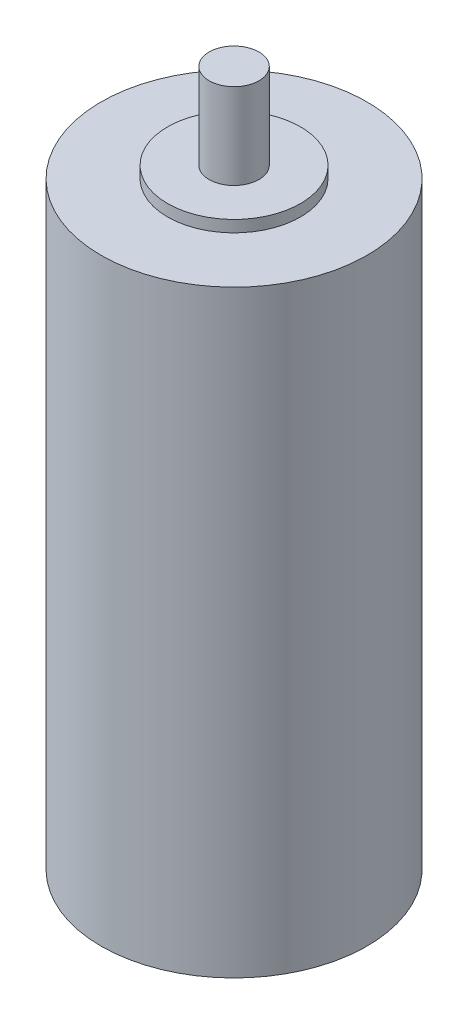
ISO-10303-21;
HEADER;
FILE_DESCRIPTION(('STEP AP214'),'2;1');
FILE_NAME('part.step','',(''),(''),'','','');
FILE_SCHEMA(('AUTOMOTIVE_DESIGN { 1 0 10303 214 1 1 1 1 }'));
ENDSEC;
DATA;
#1=APPLICATION_CONTEXT('core data for automotive mechanical design processes');
#2=APPLICATION_PROTOCOL_DEFINITION('international standard','automotive_design',2000,#1);
#3=PRODUCT_CONTEXT('',#1,'mechanical');
#4=PRODUCT('Part','Part','',(#3));
#5=PRODUCT_RELATED_PRODUCT_CATEGORY('part','',(#4));
#6=PRODUCT_DEFINITION_FORMATION('','',#4);
#7=PRODUCT_DEFINITION_CONTEXT('part definition',#1,'design');
#8=PRODUCT_DEFINITION('design','',#6,#7);
#9=PRODUCT_DEFINITION_SHAPE('','',#8);
#10=(LENGTH_UNIT() NAMED_UNIT(*) SI_UNIT(.MILLI.,.METRE.));
#11=(NAMED_UNIT(*) PLANE_ANGLE_UNIT() SI_UNIT($,.RADIAN.));
#12=(NAMED_UNIT(*) SI_UNIT($,.STERADIAN.) SOLID_ANGLE_UNIT());
#13=UNCERTAINTY_MEASURE_WITH_UNIT(LENGTH_MEASURE(1.E-05),#10,'distance_accuracy_value','');
#14=(GEOMETRIC_REPRESENTATION_CONTEXT(3) GLOBAL_UNCERTAINTY_ASSIGNED_CONTEXT((#13)) GLOBAL_UNIT_ASSIGNED_CONTEXT((#10,
#11,#12)) REPRESENTATION_CONTEXT('',''));
#15=CARTESIAN_POINT('',(0.,0.,0.));
#16=DIRECTION('',(0.,0.,1.));
#17=DIRECTION('',(1.,0.,0.));
#18=AXIS2_PLACEMENT_3D('',#15,#16,#17);
#19=CARTESIAN_POINT('',(0.,72.,0.));
#20=DIRECTION('',(0.,-1.,0.));
#21=DIRECTION('',(0.,0.,-1.));
#22=AXIS2_PLACEMENT_3D('',#19,#20,#21);
#23=CYLINDRICAL_SURFACE('',#22,16.);
#24=CARTESIAN_POINT('',(0.,72.,0.));
#25=DIRECTION('',(0.,1.,0.));
#26=DIRECTION('',(0.,0.,1.));
#27=AXIS2_PLACEMENT_3D('',#24,#25,#26);
#28=CIRCLE('',#27,16.);
#29=CARTESIAN_POINT('',(0.,72.,16.));
#30=VERTEX_POINT('',#29);
#31=EDGE_CURVE('E44',#30,#30,#28,.T.);
#32=ORIENTED_EDGE('',*,*,#31,.F.);
#33=EDGE_LOOP('',(#32));
#34=FACE_BOUND('',#33,.T.);
#35=CARTESIAN_POINT('',(0.,0.,0.));
#36=DIRECTION('',(0.,1.,0.));
#37=DIRECTION('',(0.,0.,1.));
#38=AXIS2_PLACEMENT_3D('',#35,#36,#37);
#39=CIRCLE('',#38,16.);
#40=CARTESIAN_POINT('',(0.,0.,16.));
#41=VERTEX_POINT('',#40);
#42=EDGE_CURVE('E50',#41,#41,#39,.T.);
#43=ORIENTED_EDGE('',*,*,#42,.T.);
#44=EDGE_LOOP('',(#43));
#45=FACE_BOUND('',#44,.T.);
#46=ADVANCED_FACE('F36',(#34,#45),#23,.T.);
#47=CARTESIAN_POINT('',(0.,72.,0.));
#48=DIRECTION('',(0.,1.,0.));
#49=DIRECTION('',(0.,0.,1.));
#50=AXIS2_PLACEMENT_3D('',#47,#48,#49);
#51=PLANE('',#50);
#52=CARTESIAN_POINT('',(0.,72.,0.));
#53=DIRECTION('',(0.,1.,0.));
#54=DIRECTION('',(0.,0.,1.));
#55=AXIS2_PLACEMENT_3D('',#52,#53,#54);
#56=CIRCLE('',#55,8.);
#57=CARTESIAN_POINT('',(0.,72.,8.));
#58=VERTEX_POINT('',#57);
#59=EDGE_CURVE('E10',#58,#58,#56,.T.);
#60=ORIENTED_EDGE('',*,*,#59,.F.);
#61=EDGE_LOOP('',(#60));
#62=FACE_BOUND('',#61,.T.);
#63=ORIENTED_EDGE('',*,*,#31,.T.);
#64=EDGE_LOOP('',(#63));
#65=FACE_BOUND('',#64,.T.);
#66=ADVANCED_FACE('F87',(#62,#65),#51,.T.);
#67=CARTESIAN_POINT('',(0.,0.,0.));
#68=DIRECTION('',(0.,1.,0.));
#69=DIRECTION('',(0.,0.,1.));
#70=AXIS2_PLACEMENT_3D('',#67,#68,#69);
#71=PLANE('',#70);
#72=ORIENTED_EDGE('',*,*,#42,.F.);
#73=EDGE_LOOP('',(#72));
#74=FACE_BOUND('',#73,.T.);
#75=ADVANCED_FACE('F92',(#74),#71,.F.);
#76=CARTESIAN_POINT('',(0.,73.4,0.));
#77=DIRECTION('',(0.,-1.,0.));
#78=DIRECTION('',(0.,0.,-1.));
#79=AXIS2_PLACEMENT_3D('',#76,#77,#78);
#80=CYLINDRICAL_SURFACE('',#79,8.);
#81=CARTESIAN_POINT('',(0.,73.4,0.));
#82=DIRECTION('',(0.,1.,0.));
#83=DIRECTION('',(0.,0.,1.));
#84=AXIS2_PLACEMENT_3D('',#81,#82,#83);
#85=CIRCLE('',#84,8.);
#86=CARTESIAN_POINT('',(0.,73.4,8.));
#87=VERTEX_POINT('',#86);
#88=EDGE_CURVE('E53',#87,#87,#85,.T.);
#89=ORIENTED_EDGE('',*,*,#88,.F.);
#90=EDGE_LOOP('',(#89));
#91=FACE_BOUND('',#90,.T.);
#92=ORIENTED_EDGE('',*,*,#59,.T.);
#93=EDGE_LOOP('',(#92));
#94=FACE_BOUND('',#93,.T.);
#95=ADVANCED_FACE('F84',(#91,#94),#80,.T.);
#96=CARTESIAN_POINT('',(0.,73.4,0.));
#97=DIRECTION('',(0.,1.,0.));
#98=DIRECTION('',(0.,0.,1.));
#99=AXIS2_PLACEMENT_3D('',#96,#97,#98);
#100=PLANE('',#99);
#101=CARTESIAN_POINT('',(0.,73.4,0.));
#102=DIRECTION('',(0.,1.,0.));
#103=DIRECTION('',(0.,0.,1.));
#104=AXIS2_PLACEMENT_3D('',#101,#102,#103);
#105=CIRCLE('',#104,3.);
#106=CARTESIAN_POINT('',(0.,73.4,3.));
#107=VERTEX_POINT('',#106);
#108=EDGE_CURVE('E39',#107,#107,#105,.F.);
#109=ORIENTED_EDGE('',*,*,#108,.T.);
#110=EDGE_LOOP('',(#109));
#111=FACE_BOUND('',#110,.T.);
#112=ORIENTED_EDGE('',*,*,#88,.T.);
#113=EDGE_LOOP('',(#112));
#114=FACE_BOUND('',#113,.T.);
#115=ADVANCED_FACE('F76',(#111,#114),#100,.T.);
#116=CARTESIAN_POINT('',(0.,83.7,0.));
#117=DIRECTION('',(0.,-1.,0.));
#118=DIRECTION('',(0.,0.,-1.));
#119=AXIS2_PLACEMENT_3D('',#116,#117,#118);
#120=CYLINDRICAL_SURFACE('',#119,3.);
#121=ORIENTED_EDGE('',*,*,#108,.F.);
#122=EDGE_LOOP('',(#121));
#123=FACE_BOUND('',#122,.T.);
#124=CARTESIAN_POINT('',(0.,83.7,0.));
#125=DIRECTION('',(0.,1.,0.));
#126=DIRECTION('',(0.,0.,1.));
#127=AXIS2_PLACEMENT_3D('',#124,#125,#126);
#128=CIRCLE('',#127,3.);
#129=CARTESIAN_POINT('',(0.,83.7,3.));
#130=VERTEX_POINT('',#129);
#131=EDGE_CURVE('E65',#130,#130,#128,.T.);
#132=ORIENTED_EDGE('',*,*,#131,.F.);
#133=EDGE_LOOP('',(#132));
#134=FACE_BOUND('',#133,.T.);
#135=ADVANCED_FACE('F74',(#123,#134),#120,.T.);
#136=CARTESIAN_POINT('',(0.,83.7,0.));
#137=DIRECTION('',(0.,1.,0.));
#138=DIRECTION('',(0.,0.,1.));
#139=AXIS2_PLACEMENT_3D('',#136,#137,#138);
#140=PLANE('',#139);
#141=ORIENTED_EDGE('',*,*,#131,.T.);
#142=EDGE_LOOP('',(#141));
#143=FACE_BOUND('',#142,.T.);
#144=ADVANCED_FACE('F72',(#143),#140,.T.);
#145=CLOSED_SHELL('',(#46,#66,#75,#95,#115,#135,#144));
#146=MANIFOLD_SOLID_BREP('B2',#145);
#147=ADVANCED_BREP_SHAPE_REPRESENTATION('',(#18,#146),#14);
#148=SHAPE_DEFINITION_REPRESENTATION(#9,#147);
ENDSEC;
END-ISO-10303-21;
